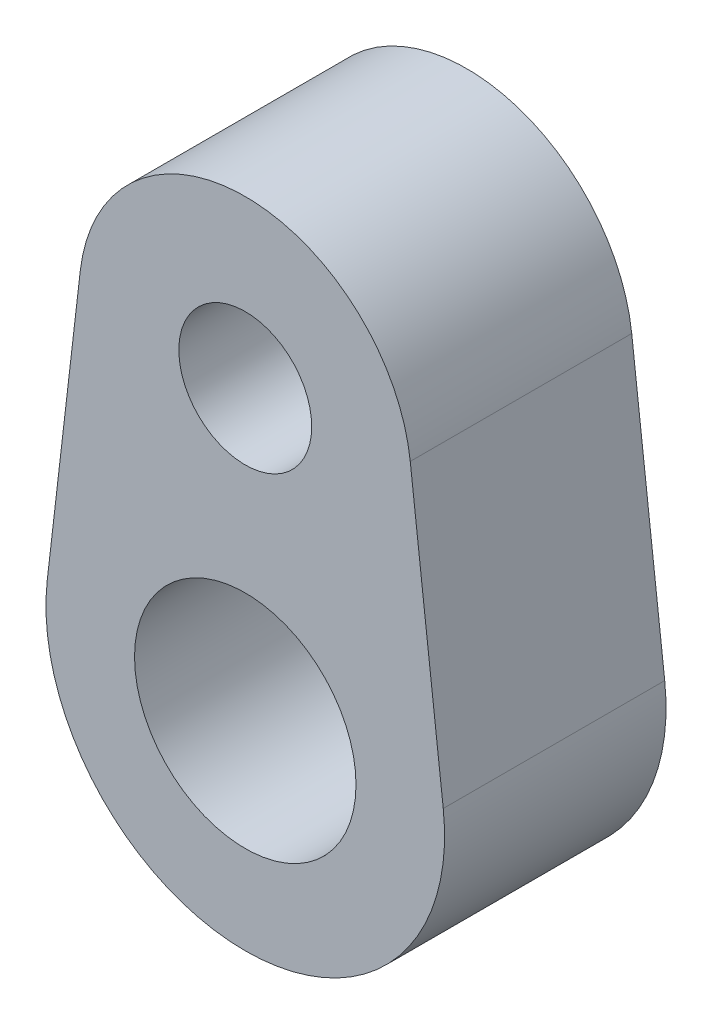
ISO-10303-21;
HEADER;
FILE_DESCRIPTION(('STEP AP214'),'2;1');
FILE_NAME('part.step','',(''),(''),'','','');
FILE_SCHEMA(('AUTOMOTIVE_DESIGN { 1 0 10303 214 1 1 1 1 }'));
ENDSEC;
DATA;
#1=APPLICATION_CONTEXT('core data for automotive mechanical design processes');
#2=APPLICATION_PROTOCOL_DEFINITION('international standard','automotive_design',2000,#1);
#3=PRODUCT_CONTEXT('',#1,'mechanical');
#4=PRODUCT('Part','Part','',(#3));
#5=PRODUCT_RELATED_PRODUCT_CATEGORY('part','',(#4));
#6=PRODUCT_DEFINITION_FORMATION('','',#4);
#7=PRODUCT_DEFINITION_CONTEXT('part definition',#1,'design');
#8=PRODUCT_DEFINITION('design','',#6,#7);
#9=PRODUCT_DEFINITION_SHAPE('','',#8);
#10=(LENGTH_UNIT() NAMED_UNIT(*) SI_UNIT(.MILLI.,.METRE.));
#11=(NAMED_UNIT(*) PLANE_ANGLE_UNIT() SI_UNIT($,.RADIAN.));
#12=(NAMED_UNIT(*) SI_UNIT($,.STERADIAN.) SOLID_ANGLE_UNIT());
#13=UNCERTAINTY_MEASURE_WITH_UNIT(LENGTH_MEASURE(1.E-05),#10,'distance_accuracy_value','');
#14=(GEOMETRIC_REPRESENTATION_CONTEXT(3) GLOBAL_UNCERTAINTY_ASSIGNED_CONTEXT((#13)) GLOBAL_UNIT_ASSIGNED_CONTEXT((#10,
#11,#12)) REPRESENTATION_CONTEXT('',''));
#15=CARTESIAN_POINT('',(0.,0.,0.));
#16=DIRECTION('',(0.,0.,1.));
#17=DIRECTION('',(1.,0.,0.));
#18=AXIS2_PLACEMENT_3D('',#15,#16,#17);
#19=CARTESIAN_POINT('',(0.,0.,5.));
#20=DIRECTION('',(0.,0.,1.));
#21=DIRECTION('',(1.,0.,0.));
#22=AXIS2_PLACEMENT_3D('',#19,#20,#21);
#23=PLANE('',#22);
#24=CARTESIAN_POINT('',(0.,13.,5.));
#25=DIRECTION('',(0.,0.,1.));
#26=DIRECTION('',(1.,0.,0.));
#27=AXIS2_PLACEMENT_3D('',#24,#25,#26);
#28=CIRCLE('',#27,3.);
#29=CARTESIAN_POINT('',(3.,13.,5.));
#30=VERTEX_POINT('',#29);
#31=EDGE_CURVE('E160',#30,#30,#28,.T.);
#32=ORIENTED_EDGE('',*,*,#31,.F.);
#33=EDGE_LOOP('',(#32));
#34=FACE_BOUND('',#33,.T.);
#35=CARTESIAN_POINT('',(0.,0.,5.));
#36=DIRECTION('',(0.,0.,1.));
#37=DIRECTION('',(1.,0.,0.));
#38=AXIS2_PLACEMENT_3D('',#35,#36,#37);
#39=CIRCLE('',#38,9.);
#40=CARTESIAN_POINT('',(-8.93988801010036,1.03846153846154,5.));
#41=VERTEX_POINT('',#40);
#42=CARTESIAN_POINT('',(8.93988801010036,1.03846153846154,5.));
#43=VERTEX_POINT('',#42);
#44=EDGE_CURVE('E172',#41,#43,#39,.T.);
#45=ORIENTED_EDGE('',*,*,#44,.T.);
#46=DIRECTION('',(-0.115384615384616,0.993320890011151,0.));
#47=VECTOR('',#46,1.);
#48=CARTESIAN_POINT('',(8.93988801010036,1.03846153846154,5.));
#49=LINE('',#48,#47);
#50=CARTESIAN_POINT('',(7.44990667508363,13.8653846153846,5.));
#51=VERTEX_POINT('',#50);
#52=EDGE_CURVE('E95',#43,#51,#49,.T.);
#53=ORIENTED_EDGE('',*,*,#52,.T.);
#54=CARTESIAN_POINT('',(0.,13.,5.));
#55=DIRECTION('',(0.,0.,1.));
#56=DIRECTION('',(1.,0.,0.));
#57=AXIS2_PLACEMENT_3D('',#54,#55,#56);
#58=CIRCLE('',#57,7.5);
#59=CARTESIAN_POINT('',(-7.44990667508363,13.8653846153846,5.));
#60=VERTEX_POINT('',#59);
#61=EDGE_CURVE('E179',#51,#60,#58,.T.);
#62=ORIENTED_EDGE('',*,*,#61,.T.);
#63=DIRECTION('',(-0.115384615384615,-0.993320890011151,0.));
#64=VECTOR('',#63,1.);
#65=CARTESIAN_POINT('',(-7.44990667508363,13.8653846153846,5.));
#66=LINE('',#65,#64);
#67=EDGE_CURVE('E66',#60,#41,#66,.T.);
#68=ORIENTED_EDGE('',*,*,#67,.T.);
#69=EDGE_LOOP('',(#45,#53,#62,#68));
#70=FACE_BOUND('',#69,.T.);
#71=CARTESIAN_POINT('',(0.,0.,5.));
#72=DIRECTION('',(0.,0.,1.));
#73=DIRECTION('',(1.,0.,0.));
#74=AXIS2_PLACEMENT_3D('',#71,#72,#73);
#75=CIRCLE('',#74,5.);
#76=CARTESIAN_POINT('',(5.,0.,5.));
#77=VERTEX_POINT('',#76);
#78=EDGE_CURVE('E188',#77,#77,#75,.T.);
#79=ORIENTED_EDGE('',*,*,#78,.F.);
#80=EDGE_LOOP('',(#79));
#81=FACE_BOUND('',#80,.T.);
#82=ADVANCED_FACE('F43',(#34,#70,#81),#23,.T.);
#83=CARTESIAN_POINT('',(0.,0.,-5.));
#84=DIRECTION('',(0.,0.,1.));
#85=DIRECTION('',(1.,0.,0.));
#86=AXIS2_PLACEMENT_3D('',#83,#84,#85);
#87=PLANE('',#86);
#88=CARTESIAN_POINT('',(0.,0.,-5.));
#89=DIRECTION('',(0.,0.,1.));
#90=DIRECTION('',(1.,0.,0.));
#91=AXIS2_PLACEMENT_3D('',#88,#89,#90);
#92=CIRCLE('',#91,9.);
#93=CARTESIAN_POINT('',(-8.93988801010036,1.03846153846154,-5.));
#94=VERTEX_POINT('',#93);
#95=CARTESIAN_POINT('',(8.93988801010036,1.03846153846154,-5.));
#96=VERTEX_POINT('',#95);
#97=EDGE_CURVE('E156',#94,#96,#92,.T.);
#98=ORIENTED_EDGE('',*,*,#97,.F.);
#99=DIRECTION('',(-0.115384615384615,-0.993320890011151,0.));
#100=VECTOR('',#99,1.);
#101=CARTESIAN_POINT('',(-7.44990667508363,13.8653846153846,-5.));
#102=LINE('',#101,#100);
#103=CARTESIAN_POINT('',(-7.44990667508363,13.8653846153846,-5.));
#104=VERTEX_POINT('',#103);
#105=EDGE_CURVE('E87',#104,#94,#102,.T.);
#106=ORIENTED_EDGE('',*,*,#105,.F.);
#107=CARTESIAN_POINT('',(0.,13.,-5.));
#108=DIRECTION('',(0.,0.,1.));
#109=DIRECTION('',(1.,0.,0.));
#110=AXIS2_PLACEMENT_3D('',#107,#108,#109);
#111=CIRCLE('',#110,7.5);
#112=CARTESIAN_POINT('',(7.44990667508363,13.8653846153846,-5.));
#113=VERTEX_POINT('',#112);
#114=EDGE_CURVE('E162',#113,#104,#111,.T.);
#115=ORIENTED_EDGE('',*,*,#114,.F.);
#116=DIRECTION('',(-0.115384615384616,0.993320890011151,0.));
#117=VECTOR('',#116,1.);
#118=CARTESIAN_POINT('',(8.93988801010036,1.03846153846154,-5.));
#119=LINE('',#118,#117);
#120=EDGE_CURVE('E159',#96,#113,#119,.T.);
#121=ORIENTED_EDGE('',*,*,#120,.F.);
#122=EDGE_LOOP('',(#98,#106,#115,#121));
#123=FACE_BOUND('',#122,.T.);
#124=CARTESIAN_POINT('',(0.,13.,-5.));
#125=DIRECTION('',(0.,0.,1.));
#126=DIRECTION('',(1.,0.,0.));
#127=AXIS2_PLACEMENT_3D('',#124,#125,#126);
#128=CIRCLE('',#127,3.);
#129=CARTESIAN_POINT('',(3.,13.,-5.));
#130=VERTEX_POINT('',#129);
#131=EDGE_CURVE('E165',#130,#130,#128,.T.);
#132=ORIENTED_EDGE('',*,*,#131,.T.);
#133=EDGE_LOOP('',(#132));
#134=FACE_BOUND('',#133,.T.);
#135=CARTESIAN_POINT('',(0.,0.,-5.));
#136=DIRECTION('',(0.,0.,1.));
#137=DIRECTION('',(1.,0.,0.));
#138=AXIS2_PLACEMENT_3D('',#135,#136,#137);
#139=CIRCLE('',#138,5.);
#140=CARTESIAN_POINT('',(5.,0.,-5.));
#141=VERTEX_POINT('',#140);
#142=EDGE_CURVE('E186',#141,#141,#139,.T.);
#143=ORIENTED_EDGE('',*,*,#142,.T.);
#144=EDGE_LOOP('',(#143));
#145=FACE_BOUND('',#144,.T.);
#146=ADVANCED_FACE('F134',(#123,#134,#145),#87,.F.);
#147=CARTESIAN_POINT('',(0.,0.,5.));
#148=DIRECTION('',(0.,0.,-1.));
#149=DIRECTION('',(-1.,0.,0.));
#150=AXIS2_PLACEMENT_3D('',#147,#148,#149);
#151=CYLINDRICAL_SURFACE('',#150,9.);
#152=ORIENTED_EDGE('',*,*,#97,.T.);
#153=DIRECTION('',(0.,0.,-1.));
#154=VECTOR('',#153,1.);
#155=CARTESIAN_POINT('',(8.93988801010036,1.03846153846154,5.));
#156=LINE('',#155,#154);
#157=EDGE_CURVE('E113',#43,#96,#156,.T.);
#158=ORIENTED_EDGE('',*,*,#157,.F.);
#159=ORIENTED_EDGE('',*,*,#44,.F.);
#160=DIRECTION('',(0.,0.,-1.));
#161=VECTOR('',#160,1.);
#162=CARTESIAN_POINT('',(-8.93988801010036,1.03846153846154,5.));
#163=LINE('',#162,#161);
#164=EDGE_CURVE('E158',#41,#94,#163,.T.);
#165=ORIENTED_EDGE('',*,*,#164,.T.);
#166=EDGE_LOOP('',(#152,#158,#159,#165));
#167=FACE_BOUND('',#166,.T.);
#168=ADVANCED_FACE('F138',(#167),#151,.T.);
#169=CARTESIAN_POINT('',(8.93988801010036,1.03846153846154,5.));
#170=DIRECTION('',(-0.993320890011151,-0.115384615384616,0.));
#171=DIRECTION('',(0.115384615384616,-0.993320890011151,0.));
#172=AXIS2_PLACEMENT_3D('',#169,#170,#171);
#173=PLANE('',#172);
#174=ORIENTED_EDGE('',*,*,#120,.T.);
#175=DIRECTION('',(0.,0.,-1.));
#176=VECTOR('',#175,1.);
#177=CARTESIAN_POINT('',(7.44990667508363,13.8653846153846,5.));
#178=LINE('',#177,#176);
#179=EDGE_CURVE('E114',#51,#113,#178,.T.);
#180=ORIENTED_EDGE('',*,*,#179,.F.);
#181=ORIENTED_EDGE('',*,*,#52,.F.);
#182=ORIENTED_EDGE('',*,*,#157,.T.);
#183=EDGE_LOOP('',(#174,#180,#181,#182));
#184=FACE_BOUND('',#183,.T.);
#185=ADVANCED_FACE('F146',(#184),#173,.F.);
#186=CARTESIAN_POINT('',(0.,13.,5.));
#187=DIRECTION('',(0.,0.,-1.));
#188=DIRECTION('',(-1.,0.,0.));
#189=AXIS2_PLACEMENT_3D('',#186,#187,#188);
#190=CYLINDRICAL_SURFACE('',#189,7.5);
#191=ORIENTED_EDGE('',*,*,#114,.T.);
#192=DIRECTION('',(0.,0.,-1.));
#193=VECTOR('',#192,1.);
#194=CARTESIAN_POINT('',(-7.44990667508363,13.8653846153846,5.));
#195=LINE('',#194,#193);
#196=EDGE_CURVE('E174',#60,#104,#195,.T.);
#197=ORIENTED_EDGE('',*,*,#196,.F.);
#198=ORIENTED_EDGE('',*,*,#61,.F.);
#199=ORIENTED_EDGE('',*,*,#179,.T.);
#200=EDGE_LOOP('',(#191,#197,#198,#199));
#201=FACE_BOUND('',#200,.T.);
#202=ADVANCED_FACE('F142',(#201),#190,.T.);
#203=CARTESIAN_POINT('',(-7.44990667508363,13.8653846153846,5.));
#204=DIRECTION('',(0.993320890011151,-0.115384615384615,0.));
#205=DIRECTION('',(0.115384615384615,0.993320890011151,0.));
#206=AXIS2_PLACEMENT_3D('',#203,#204,#205);
#207=PLANE('',#206);
#208=CARTESIAN_POINT('',(-8.11757491615173,8.11757491615176,0.));
#209=DIRECTION('',(0.993320890011151,-0.115384615384615,0.));
#210=DIRECTION('',(0.115384615384615,0.993320890011151,0.));
#211=AXIS2_PLACEMENT_3D('',#208,#209,#210);
#212=ELLIPSE('',#211,2.67866305933366,2.09999999999999);
#213=CARTESIAN_POINT('',(-7.80849840930554,10.7783468902891,0.));
#214=VERTEX_POINT('',#213);
#215=EDGE_CURVE('E47',#214,#214,#212,.T.);
#216=ORIENTED_EDGE('',*,*,#215,.T.);
#217=EDGE_LOOP('',(#216));
#218=FACE_BOUND('',#217,.T.);
#219=ORIENTED_EDGE('',*,*,#105,.T.);
#220=ORIENTED_EDGE('',*,*,#164,.F.);
#221=ORIENTED_EDGE('',*,*,#67,.F.);
#222=ORIENTED_EDGE('',*,*,#196,.T.);
#223=EDGE_LOOP('',(#219,#220,#221,#222));
#224=FACE_BOUND('',#223,.T.);
#225=ADVANCED_FACE('F130',(#218,#224),#207,.F.);
#226=CARTESIAN_POINT('',(0.,13.,5.));
#227=DIRECTION('',(0.,0.,-1.));
#228=DIRECTION('',(-1.,0.,0.));
#229=AXIS2_PLACEMENT_3D('',#226,#227,#228);
#230=CYLINDRICAL_SURFACE('',#229,3.);
#231=ORIENTED_EDGE('',*,*,#31,.T.);
#232=EDGE_LOOP('',(#231));
#233=FACE_BOUND('',#232,.T.);
#234=ORIENTED_EDGE('',*,*,#131,.F.);
#235=EDGE_LOOP('',(#234));
#236=FACE_BOUND('',#235,.T.);
#237=ADVANCED_FACE('F126',(#233,#236),#230,.F.);
#238=CARTESIAN_POINT('',(0.,0.,5.));
#239=DIRECTION('',(0.,0.,-1.));
#240=DIRECTION('',(-1.,0.,0.));
#241=AXIS2_PLACEMENT_3D('',#238,#239,#240);
#242=CYLINDRICAL_SURFACE('',#241,5.);
#243=CARTESIAN_POINT('',(-4.83703232400487,1.26614307901282,0.));
#244=CARTESIAN_POINT('',(-4.8370340825604,1.26616014309308,-0.131363315996297));
#245=CARTESIAN_POINT('',(-4.83404073821214,1.27774743935389,-0.26289320864018));
#246=CARTESIAN_POINT('',(-4.82181776242157,1.32309789657817,-0.52189651173502));
#247=CARTESIAN_POINT('',(-4.81257528922041,1.35690671806252,-0.649361001975908));
#248=CARTESIAN_POINT('',(-4.78723744561482,1.443735303701,-0.895999556916994));
#249=CARTESIAN_POINT('',(-4.77117902281201,1.49665126514315,-1.01521434702642));
#250=CARTESIAN_POINT('',(-4.73127480566743,1.61837220761906,-1.2437382262223));
#251=CARTESIAN_POINT('',(-4.70742845703709,1.68717831949735,-1.35304660953433));
#252=CARTESIAN_POINT('',(-4.64846879789581,1.84371819802282,-1.56881867155691));
#253=CARTESIAN_POINT('',(-4.61257565081972,1.93255808571857,-1.67426722292441));
#254=CARTESIAN_POINT('',(-4.52895361991494,2.12113684585783,-1.86966715543661));
#255=CARTESIAN_POINT('',(-4.48121875971469,2.22088120739887,-1.95961067240674));
#256=CARTESIAN_POINT('',(-4.36900022920088,2.43461938135819,-2.12753468591427));
#257=CARTESIAN_POINT('',(-4.30358710927795,2.54912157190835,-2.20425899831956));
#258=CARTESIAN_POINT('',(-4.15729622978636,2.78130553943003,-2.33475212238194));
#259=CARTESIAN_POINT('',(-4.0764284710541,2.89898521816143,-2.38853570684542));
#260=CARTESIAN_POINT('',(-3.90640445190919,3.12384552025361,-2.46757533309459));
#261=CARTESIAN_POINT('',(-3.8182710111189,3.23116980480672,-2.49461364767322));
#262=CARTESIAN_POINT('',(-3.63145589966596,3.43977982842078,-2.52527210936634));
#263=CARTESIAN_POINT('',(-3.53278079775934,3.54106926734004,-2.52890675432531));
#264=CARTESIAN_POINT('',(-3.33734205706136,3.72539888231098,-2.51332549889624));
#265=CARTESIAN_POINT('',(-3.24118468515943,3.80926084439323,-2.49610708865486));
#266=CARTESIAN_POINT('',(-3.04600113811626,3.96706826549748,-2.44289343135227));
#267=CARTESIAN_POINT('',(-2.94697474844992,4.0410129806379,-2.40689677674509));
#268=CARTESIAN_POINT('',(-2.74794920181003,4.17895321866054,-2.31693472817252));
#269=CARTESIAN_POINT('',(-2.64795514701322,4.24279964531114,-2.26273146048073));
#270=CARTESIAN_POINT('',(-2.4515254246045,4.35925231419662,-2.13823398449487));
#271=CARTESIAN_POINT('',(-2.3550910361408,4.41185454779963,-2.06793405606864));
#272=CARTESIAN_POINT('',(-2.15983489752377,4.51089972163403,-1.905499058825));
#273=CARTESIAN_POINT('',(-2.06167135699284,4.55626794170448,-1.81191639577123));
#274=CARTESIAN_POINT('',(-1.87702306463446,4.63539601568079,-1.60943648817567));
#275=CARTESIAN_POINT('',(-1.79054762772852,4.66914664360515,-1.50052716838516));
#276=CARTESIAN_POINT('',(-1.62819899581942,4.72831059251744,-1.26173473954059));
#277=CARTESIAN_POINT('',(-1.5533966269222,4.75302989346488,-1.13094345894826));
#278=CARTESIAN_POINT('',(-1.42707824533952,4.79248054018748,-0.85718484409937));
#279=CARTESIAN_POINT('',(-1.37553755551136,4.80722247877988,-0.71423060523162));
#280=CARTESIAN_POINT('',(-1.30355885895739,4.82721826923302,-0.4321717892119));
#281=CARTESIAN_POINT('',(-1.28096895895928,4.83313480440649,-0.293668783675359));
#282=CARTESIAN_POINT('',(-1.26188100841433,4.83815849111538,-0.0147917643824579));
#283=CARTESIAN_POINT('',(-1.26536365253661,4.83727068089476,0.125580788208194));
#284=CARTESIAN_POINT('',(-1.29612974314519,4.82910227336414,0.387333075883686));
#285=CARTESIAN_POINT('',(-1.32068699342599,4.82255331536969,0.509070588710303));
#286=CARTESIAN_POINT('',(-1.38807469039182,4.80358870234619,0.746885088387132));
#287=CARTESIAN_POINT('',(-1.43091120963619,4.79117109754534,0.862960179830829));
#288=CARTESIAN_POINT('',(-1.53451176297572,4.75902633553207,1.0922648969725));
#289=CARTESIAN_POINT('',(-1.59601231421526,4.73898811487246,1.2051156002034));
#290=CARTESIAN_POINT('',(-1.73281260600809,4.69069505310628,1.42019663593913));
#291=CARTESIAN_POINT('',(-1.80811944635786,4.6624359800711,1.52242146157654));
#292=CARTESIAN_POINT('',(-1.97987092715602,4.59236016577735,1.72715964962677));
#293=CARTESIAN_POINT('',(-2.07778934046017,4.54926408981736,1.82800638224476));
#294=CARTESIAN_POINT('',(-2.28308723099838,4.44977783351911,2.01207318542359));
#295=CARTESIAN_POINT('',(-2.39047009113966,4.39338288755681,2.09528691689065));
#296=CARTESIAN_POINT('',(-2.61359877552039,4.26452138683386,2.2437520121135));
#297=CARTESIAN_POINT('',(-2.72949557909843,4.1916434180983,2.30842530555055));
#298=CARTESIAN_POINT('',(-2.96176544281174,4.03085912698123,2.41374668004157));
#299=CARTESIAN_POINT('',(-3.07813798219035,3.9429663503826,2.4544162702596));
#300=CARTESIAN_POINT('',(-3.29555489762247,3.76263060419985,2.50700569085941));
#301=CARTESIAN_POINT('',(-3.39701888442701,3.67136900736508,2.52124548944528));
#302=CARTESIAN_POINT('',(-3.59239387319746,3.48042163014576,2.52744906717703));
#303=CARTESIAN_POINT('',(-3.68630761704722,3.38073893511388,2.51942097089156));
#304=CARTESIAN_POINT('',(-3.85767842668209,3.18343306320011,2.48283501605388));
#305=CARTESIAN_POINT('',(-3.93582055432417,3.08613160053373,2.45571186069382));
#306=CARTESIAN_POINT('',(-4.08173686403564,2.89038687150805,2.38366619977426));
#307=CARTESIAN_POINT('',(-4.14950958548811,2.79194344639102,2.33874118986932));
#308=CARTESIAN_POINT('',(-4.27684594952085,2.59290167754663,2.23040922398743));
#309=CARTESIAN_POINT('',(-4.33594282432823,2.49238755466342,2.16630270094445));
#310=CARTESIAN_POINT('',(-4.44268482746706,2.29673518052364,2.02230390251226));
#311=CARTESIAN_POINT('',(-4.49032469547886,2.20159941393731,1.94240440656319));
#312=CARTESIAN_POINT('',(-4.57926044856807,2.01061232739863,1.75970696172679));
#313=CARTESIAN_POINT('',(-4.61942563236672,1.91566383623505,1.65540964339021));
#314=CARTESIAN_POINT('',(-4.68833231492229,1.7402412531095,1.43178644684259));
#315=CARTESIAN_POINT('',(-4.71706336990411,1.65978043053835,1.31244695970107));
#316=CARTESIAN_POINT('',(-4.76543357444117,1.51547719799224,1.05649487575512));
#317=CARTESIAN_POINT('',(-4.78472261530485,1.45230837866958,0.91942657741783));
#318=CARTESIAN_POINT('',(-4.80674305768708,1.37691413404831,0.706633372088198));
#319=CARTESIAN_POINT('',(-4.81292855018529,1.35502024649148,0.63457195890305));
#320=CARTESIAN_POINT('',(-4.82315646542745,1.31815493869324,0.488567998916497));
#321=CARTESIAN_POINT('',(-4.82720037588488,1.30317871381891,0.414626795487215));
#322=CARTESIAN_POINT('',(-4.83250465853,1.28334550626391,0.283869049250486));
#323=CARTESIAN_POINT('',(-4.83420468477852,1.27690679103365,0.227305407886189));
#324=CARTESIAN_POINT('',(-4.83646817467599,1.26830173570625,0.113838289804997));
#325=CARTESIAN_POINT('',(-4.83703156182107,1.26613568318981,0.0569347904717679));
#326=CARTESIAN_POINT('',(-4.83703232400487,1.26614307901282,0.));
#327=B_SPLINE_CURVE_WITH_KNOTS('',3,(#243,#244,#245,#246,#247,#248,#249,#250,#251,#252,#253,
#254,#255,#256,#257,#258,#259,#260,#261,#262,#263,#264,#265,#266,#267,#268,#269,#270,#271,#272,
#273,#274,#275,#276,#277,#278,#279,#280,#281,#282,#283,#284,#285,#286,#287,#288,#289,#290,#291,
#292,#293,#294,#295,#296,#297,#298,#299,#300,#301,#302,#303,#304,#305,#306,#307,#308,#309,#310,
#311,#312,#313,#314,#315,#316,#317,#318,#319,#320,#321,#322,#323,#324,#325,#326),.UNSPECIFIED.,
.T.,.F.,(4,2,2,2,2,2,2,2,2,2,2,2,2,2,2,2,2,2,2,2,2,2,2,2,2,2,2,2,2,2,2,2,2,2,2,2,2,2,2,2,2,4),
(0.,0.393859556326523,0.788530951236684,1.18108971539171,1.57367642514781,1.99933086976135,
2.42520057571011,2.88049920894291,3.33550420587855,3.75759317809377,4.17942065416046,
4.56384641257686,4.94830099023102,5.33798769868278,5.72781310226732,6.15502926771618,
6.58258392361246,7.03824815742278,7.49342785720497,7.91232176885027,8.33090554254879,
8.70232153583859,9.07386101348213,9.46255758170596,9.85145459821492,10.2905599795376,
10.7298229531708,11.1815769113035,11.6329254461313,12.0423413433668,12.4516078825244,
12.8330148176169,13.2144754276797,13.61202415147,14.009755057038,14.4477559661391,
14.8861560260417,15.3397695486489,15.5661689447294,15.7924108587624,15.9631038865801,
16.1338084028652),.UNSPECIFIED.);
#328=CARTESIAN_POINT('',(-3.53553390593276,3.53553390593278,-2.52500000000008));
#329=VERTEX_POINT('',#328);
#330=CARTESIAN_POINT('',(-3.53553390593273,3.53553390593274,2.525));
#331=VERTEX_POINT('',#330);
#332=EDGE_CURVE('E11',#329,#331,#327,.T.);
#333=ORIENTED_EDGE('',*,*,#332,.F.);
#334=EDGE_CURVE('E52',#331,#329,#327,.T.);
#335=ORIENTED_EDGE('',*,*,#334,.F.);
#336=EDGE_LOOP('',(#333,#335));
#337=FACE_BOUND('',#336,.T.);
#338=ORIENTED_EDGE('',*,*,#78,.T.);
#339=EDGE_LOOP('',(#338));
#340=FACE_BOUND('',#339,.T.);
#341=ORIENTED_EDGE('',*,*,#142,.F.);
#342=EDGE_LOOP('',(#341));
#343=FACE_BOUND('',#342,.T.);
#344=ADVANCED_FACE('F111',(#337,#340,#343),#242,.F.);
#345=CARTESIAN_POINT('',(-12.7678921382001,12.7678921382001,0.));
#346=DIRECTION('',(-0.707106781186546,0.707106781186549,0.));
#347=DIRECTION('',(-0.707106781186549,-0.707106781186546,0.));
#348=AXIS2_PLACEMENT_3D('',#345,#346,#347);
#349=CYLINDRICAL_SURFACE('',#348,2.09999999999999);
#350=CARTESIAN_POINT('',(-3.83605428793701,3.83605428793702,0.));
#351=DIRECTION('',(-0.707106781186546,0.707106781186549,0.));
#352=DIRECTION('',(-0.707106781186549,-0.707106781186546,0.));
#353=AXIS2_PLACEMENT_3D('',#350,#351,#352);
#354=CIRCLE('',#353,2.1);
#355=CARTESIAN_POINT('',(-5.32097852842876,2.35113004744528,0.));
#356=VERTEX_POINT('',#355);
#357=EDGE_CURVE('E110',#356,#356,#354,.T.);
#358=ORIENTED_EDGE('',*,*,#357,.F.);
#359=EDGE_LOOP('',(#358));
#360=FACE_BOUND('',#359,.T.);
#361=ORIENTED_EDGE('',*,*,#215,.F.);
#362=EDGE_LOOP('',(#361));
#363=FACE_BOUND('',#362,.T.);
#364=ADVANCED_FACE('F125',(#360,#363),#349,.F.);
#365=CARTESIAN_POINT('',(-3.53553390593273,3.53553390593274,0.));
#366=DIRECTION('',(-0.707106781186546,0.707106781186549,0.));
#367=DIRECTION('',(-0.707106781186549,-0.707106781186546,0.));
#368=AXIS2_PLACEMENT_3D('',#365,#366,#367);
#369=CYLINDRICAL_SURFACE('',#368,2.525);
#370=ORIENTED_EDGE('',*,*,#332,.T.);
#371=CARTESIAN_POINT('',(-3.53553390593273,3.53553390593274,0.));
#372=DIRECTION('',(-0.707106781186546,0.707106781186549,0.));
#373=DIRECTION('',(-0.707106781186549,-0.707106781186546,0.));
#374=AXIS2_PLACEMENT_3D('',#371,#372,#373);
#375=CIRCLE('',#374,2.525);
#376=EDGE_CURVE('E57',#331,#329,#375,.T.);
#377=ORIENTED_EDGE('',*,*,#376,.T.);
#378=EDGE_LOOP('',(#370,#377));
#379=FACE_BOUND('',#378,.T.);
#380=ADVANCED_FACE('F99',(#379),#369,.F.);
#381=ORIENTED_EDGE('',*,*,#334,.T.);
#382=EDGE_CURVE('E104',#329,#331,#375,.T.);
#383=ORIENTED_EDGE('',*,*,#382,.T.);
#384=EDGE_LOOP('',(#381,#383));
#385=FACE_BOUND('',#384,.T.);
#386=ADVANCED_FACE('F105',(#385),#369,.F.);
#387=CARTESIAN_POINT('',(-3.83605428793701,3.83605428793702,0.));
#388=DIRECTION('',(0.707106781186546,-0.707106781186549,0.));
#389=DIRECTION('',(0.707106781186549,0.707106781186546,0.));
#390=AXIS2_PLACEMENT_3D('',#387,#388,#389);
#391=CONICAL_SURFACE('',#390,2.1,0.78539816339745);
#392=ORIENTED_EDGE('',*,*,#376,.F.);
#393=ORIENTED_EDGE('',*,*,#382,.F.);
#394=EDGE_LOOP('',(#392,#393));
#395=FACE_BOUND('',#394,.T.);
#396=ORIENTED_EDGE('',*,*,#357,.T.);
#397=EDGE_LOOP('',(#396));
#398=FACE_BOUND('',#397,.T.);
#399=ADVANCED_FACE('F108',(#395,#398),#391,.F.);
#400=CLOSED_SHELL('',(#82,#146,#168,#185,#202,#225,#237,#344,#364,#380,#386,#399));
#401=MANIFOLD_SOLID_BREP('B2',#400);
#402=ADVANCED_BREP_SHAPE_REPRESENTATION('',(#18,#401),#14);
#403=SHAPE_DEFINITION_REPRESENTATION(#9,#402);
ENDSEC;
END-ISO-10303-21;
